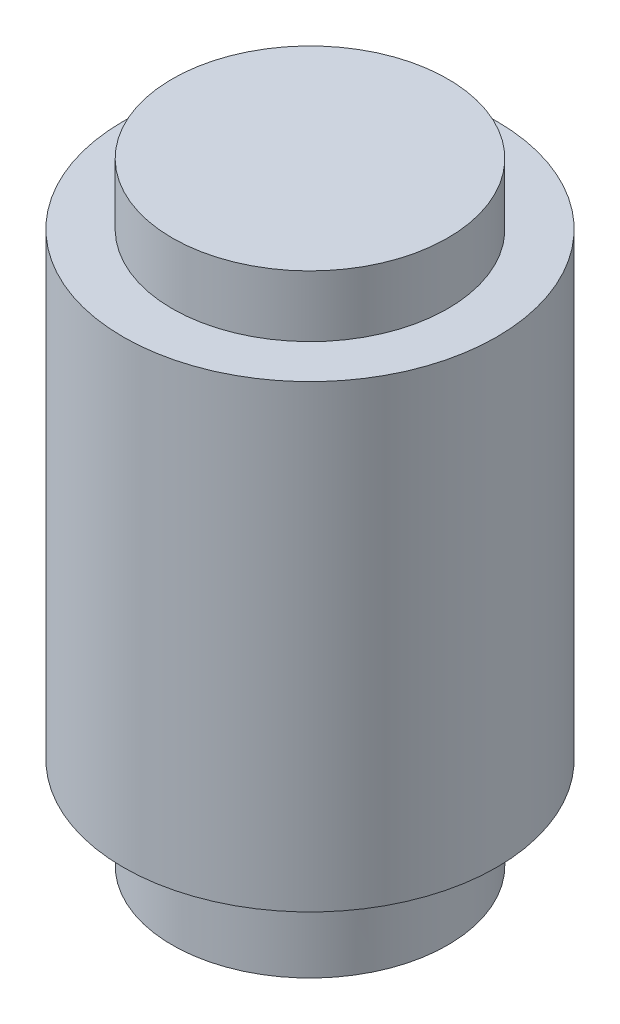
ISO-10303-21;
HEADER;
FILE_DESCRIPTION(('STEP AP214'),'2;1');
FILE_NAME('part.step','',(''),(''),'','','');
FILE_SCHEMA(('AUTOMOTIVE_DESIGN { 1 0 10303 214 1 1 1 1 }'));
ENDSEC;
DATA;
#1=APPLICATION_CONTEXT('core data for automotive mechanical design processes');
#2=APPLICATION_PROTOCOL_DEFINITION('international standard','automotive_design',2000,#1);
#3=PRODUCT_CONTEXT('',#1,'mechanical');
#4=PRODUCT('Part','Part','',(#3));
#5=PRODUCT_RELATED_PRODUCT_CATEGORY('part','',(#4));
#6=PRODUCT_DEFINITION_FORMATION('','',#4);
#7=PRODUCT_DEFINITION_CONTEXT('part definition',#1,'design');
#8=PRODUCT_DEFINITION('design','',#6,#7);
#9=PRODUCT_DEFINITION_SHAPE('','',#8);
#10=(LENGTH_UNIT() NAMED_UNIT(*) SI_UNIT(.MILLI.,.METRE.));
#11=(NAMED_UNIT(*) PLANE_ANGLE_UNIT() SI_UNIT($,.RADIAN.));
#12=(NAMED_UNIT(*) SI_UNIT($,.STERADIAN.) SOLID_ANGLE_UNIT());
#13=UNCERTAINTY_MEASURE_WITH_UNIT(LENGTH_MEASURE(1.E-05),#10,'distance_accuracy_value','');
#14=(GEOMETRIC_REPRESENTATION_CONTEXT(3) GLOBAL_UNCERTAINTY_ASSIGNED_CONTEXT((#13)) GLOBAL_UNIT_ASSIGNED_CONTEXT((#10,
#11,#12)) REPRESENTATION_CONTEXT('',''));
#15=CARTESIAN_POINT('',(0.,0.,0.));
#16=DIRECTION('',(0.,0.,1.));
#17=DIRECTION('',(1.,0.,0.));
#18=AXIS2_PLACEMENT_3D('',#15,#16,#17);
#19=CARTESIAN_POINT('',(0.,110.,0.));
#20=DIRECTION('',(0.,-1.,0.));
#21=DIRECTION('',(0.,0.,-1.));
#22=AXIS2_PLACEMENT_3D('',#19,#20,#21);
#23=CYLINDRICAL_SURFACE('',#22,22.5);
#24=CARTESIAN_POINT('',(0.,10.,0.));
#25=DIRECTION('',(0.,-1.,0.));
#26=DIRECTION('',(0.,0.,-1.));
#27=AXIS2_PLACEMENT_3D('',#24,#25,#26);
#28=CIRCLE('',#27,22.5);
#29=CARTESIAN_POINT('',(0.,10.,-22.5));
#30=VERTEX_POINT('',#29);
#31=EDGE_CURVE('E61',#30,#30,#28,.T.);
#32=ORIENTED_EDGE('',*,*,#31,.F.);
#33=EDGE_LOOP('',(#32));
#34=FACE_BOUND('',#33,.T.);
#35=CARTESIAN_POINT('',(0.,25.,0.));
#36=DIRECTION('',(0.,1.,0.));
#37=DIRECTION('',(0.,0.,1.));
#38=AXIS2_PLACEMENT_3D('',#35,#36,#37);
#39=CIRCLE('',#38,22.5);
#40=CARTESIAN_POINT('',(0.,25.,22.5));
#41=VERTEX_POINT('',#40);
#42=EDGE_CURVE('E11',#41,#41,#39,.T.);
#43=ORIENTED_EDGE('',*,*,#42,.F.);
#44=EDGE_LOOP('',(#43));
#45=FACE_BOUND('',#44,.T.);
#46=ADVANCED_FACE('F39',(#34,#45),#23,.T.);
#47=CARTESIAN_POINT('',(0.,10.,0.));
#48=DIRECTION('',(0.,-1.,0.));
#49=DIRECTION('',(0.,0.,-1.));
#50=AXIS2_PLACEMENT_3D('',#47,#48,#49);
#51=PLANE('',#50);
#52=ORIENTED_EDGE('',*,*,#31,.T.);
#53=EDGE_LOOP('',(#52));
#54=FACE_BOUND('',#53,.T.);
#55=CARTESIAN_POINT('',(0.,10.,0.));
#56=DIRECTION('',(0.,-1.,0.));
#57=DIRECTION('',(0.,0.,-1.));
#58=AXIS2_PLACEMENT_3D('',#55,#56,#57);
#59=CIRCLE('',#58,16.7);
#60=CARTESIAN_POINT('',(0.,10.,-16.7));
#61=VERTEX_POINT('',#60);
#62=EDGE_CURVE('E60',#61,#61,#59,.F.);
#63=ORIENTED_EDGE('',*,*,#62,.T.);
#64=EDGE_LOOP('',(#63));
#65=FACE_BOUND('',#64,.T.);
#66=ADVANCED_FACE('F105',(#54,#65),#51,.T.);
#67=CARTESIAN_POINT('',(0.,157.234732983261,0.));
#68=DIRECTION('',(0.,-1.,0.));
#69=DIRECTION('',(0.,0.,-1.));
#70=AXIS2_PLACEMENT_3D('',#67,#68,#69);
#71=CYLINDRICAL_SURFACE('',#70,16.7);
#72=CARTESIAN_POINT('',(0.,90.,0.));
#73=DIRECTION('',(0.,1.,0.));
#74=DIRECTION('',(0.,0.,1.));
#75=AXIS2_PLACEMENT_3D('',#72,#73,#74);
#76=CIRCLE('',#75,16.7);
#77=CARTESIAN_POINT('',(0.,90.,16.7));
#78=VERTEX_POINT('',#77);
#79=EDGE_CURVE('E55',#78,#78,#76,.F.);
#80=ORIENTED_EDGE('',*,*,#79,.F.);
#81=EDGE_LOOP('',(#80));
#82=FACE_BOUND('',#81,.T.);
#83=ORIENTED_EDGE('',*,*,#62,.F.);
#84=EDGE_LOOP('',(#83));
#85=FACE_BOUND('',#84,.T.);
#86=ADVANCED_FACE('F110',(#82,#85),#71,.F.);
#87=CARTESIAN_POINT('',(0.,90.,0.));
#88=DIRECTION('',(0.,1.,0.));
#89=DIRECTION('',(0.,0.,1.));
#90=AXIS2_PLACEMENT_3D('',#87,#88,#89);
#91=PLANE('',#90);
#92=ORIENTED_EDGE('',*,*,#79,.T.);
#93=EDGE_LOOP('',(#92));
#94=FACE_BOUND('',#93,.T.);
#95=CARTESIAN_POINT('',(0.,90.,0.));
#96=DIRECTION('',(0.,1.,0.));
#97=DIRECTION('',(0.,0.,1.));
#98=AXIS2_PLACEMENT_3D('',#95,#96,#97);
#99=CIRCLE('',#98,13.3);
#100=CARTESIAN_POINT('',(0.,90.,13.3));
#101=VERTEX_POINT('',#100);
#102=EDGE_CURVE('E50',#101,#101,#99,.F.);
#103=ORIENTED_EDGE('',*,*,#102,.F.);
#104=EDGE_LOOP('',(#103));
#105=FACE_BOUND('',#104,.T.);
#106=ADVANCED_FACE('F120',(#94,#105),#91,.F.);
#107=CARTESIAN_POINT('',(0.,157.234732983261,0.));
#108=DIRECTION('',(0.,-1.,0.));
#109=DIRECTION('',(0.,0.,-1.));
#110=AXIS2_PLACEMENT_3D('',#107,#108,#109);
#111=CYLINDRICAL_SURFACE('',#110,13.3);
#112=ORIENTED_EDGE('',*,*,#102,.T.);
#113=EDGE_LOOP('',(#112));
#114=FACE_BOUND('',#113,.T.);
#115=CARTESIAN_POINT('',(0.,10.,0.));
#116=DIRECTION('',(0.,-1.,0.));
#117=DIRECTION('',(0.,0.,-1.));
#118=AXIS2_PLACEMENT_3D('',#115,#116,#117);
#119=CIRCLE('',#118,13.3);
#120=CARTESIAN_POINT('',(0.,10.,-13.3));
#121=VERTEX_POINT('',#120);
#122=EDGE_CURVE('E58',#121,#121,#119,.F.);
#123=ORIENTED_EDGE('',*,*,#122,.T.);
#124=EDGE_LOOP('',(#123));
#125=FACE_BOUND('',#124,.T.);
#126=ADVANCED_FACE('F102',(#114,#125),#111,.T.);
#127=ORIENTED_EDGE('',*,*,#122,.F.);
#128=EDGE_LOOP('',(#127));
#129=FACE_BOUND('',#128,.T.);
#130=ADVANCED_FACE('F93',(#129),#51,.T.);
#131=CARTESIAN_POINT('',(0.,25.,0.));
#132=DIRECTION('',(0.,1.,0.));
#133=DIRECTION('',(0.,0.,1.));
#134=AXIS2_PLACEMENT_3D('',#131,#132,#133);
#135=CYLINDRICAL_SURFACE('',#134,30.5);
#136=CARTESIAN_POINT('',(0.,25.,0.));
#137=DIRECTION('',(0.,1.,0.));
#138=DIRECTION('',(0.,0.,1.));
#139=AXIS2_PLACEMENT_3D('',#136,#137,#138);
#140=CIRCLE('',#139,30.5);
#141=CARTESIAN_POINT('',(0.,25.,30.5));
#142=VERTEX_POINT('',#141);
#143=EDGE_CURVE('E67',#142,#142,#140,.T.);
#144=ORIENTED_EDGE('',*,*,#143,.T.);
#145=EDGE_LOOP('',(#144));
#146=FACE_BOUND('',#145,.T.);
#147=CARTESIAN_POINT('',(0.,100.,0.));
#148=DIRECTION('',(0.,1.,0.));
#149=DIRECTION('',(0.,0.,1.));
#150=AXIS2_PLACEMENT_3D('',#147,#148,#149);
#151=CIRCLE('',#150,30.5);
#152=CARTESIAN_POINT('',(0.,100.,30.5));
#153=VERTEX_POINT('',#152);
#154=EDGE_CURVE('E72',#153,#153,#151,.T.);
#155=ORIENTED_EDGE('',*,*,#154,.F.);
#156=EDGE_LOOP('',(#155));
#157=FACE_BOUND('',#156,.T.);
#158=ADVANCED_FACE('F91',(#146,#157),#135,.T.);
#159=CARTESIAN_POINT('',(0.,25.,0.));
#160=DIRECTION('',(0.,1.,0.));
#161=DIRECTION('',(0.,0.,1.));
#162=AXIS2_PLACEMENT_3D('',#159,#160,#161);
#163=PLANE('',#162);
#164=ORIENTED_EDGE('',*,*,#42,.T.);
#165=EDGE_LOOP('',(#164));
#166=FACE_BOUND('',#165,.T.);
#167=ORIENTED_EDGE('',*,*,#143,.F.);
#168=EDGE_LOOP('',(#167));
#169=FACE_BOUND('',#168,.T.);
#170=ADVANCED_FACE('F87',(#166,#169),#163,.F.);
#171=CARTESIAN_POINT('',(0.,100.,0.));
#172=DIRECTION('',(0.,1.,0.));
#173=DIRECTION('',(0.,0.,1.));
#174=AXIS2_PLACEMENT_3D('',#171,#172,#173);
#175=PLANE('',#174);
#176=CARTESIAN_POINT('',(0.,100.,0.));
#177=DIRECTION('',(0.,1.,0.));
#178=DIRECTION('',(0.,0.,1.));
#179=AXIS2_PLACEMENT_3D('',#176,#177,#178);
#180=CIRCLE('',#179,22.5);
#181=CARTESIAN_POINT('',(0.,100.,22.5));
#182=VERTEX_POINT('',#181);
#183=EDGE_CURVE('E76',#182,#182,#180,.T.);
#184=ORIENTED_EDGE('',*,*,#183,.F.);
#185=EDGE_LOOP('',(#184));
#186=FACE_BOUND('',#185,.T.);
#187=ORIENTED_EDGE('',*,*,#154,.T.);
#188=EDGE_LOOP('',(#187));
#189=FACE_BOUND('',#188,.T.);
#190=ADVANCED_FACE('F83',(#186,#189),#175,.T.);
#191=CARTESIAN_POINT('',(0.,110.,0.));
#192=DIRECTION('',(0.,1.,0.));
#193=DIRECTION('',(0.,0.,1.));
#194=AXIS2_PLACEMENT_3D('',#191,#192,#193);
#195=PLANE('',#194);
#196=CARTESIAN_POINT('',(0.,110.,0.));
#197=DIRECTION('',(0.,1.,0.));
#198=DIRECTION('',(0.,0.,1.));
#199=AXIS2_PLACEMENT_3D('',#196,#197,#198);
#200=CIRCLE('',#199,22.5);
#201=CARTESIAN_POINT('',(0.,110.,22.5));
#202=VERTEX_POINT('',#201);
#203=EDGE_CURVE('E46',#202,#202,#200,.T.);
#204=ORIENTED_EDGE('',*,*,#203,.T.);
#205=EDGE_LOOP('',(#204));
#206=FACE_BOUND('',#205,.T.);
#207=ADVANCED_FACE('F86',(#206),#195,.T.);
#208=ORIENTED_EDGE('',*,*,#183,.T.);
#209=EDGE_LOOP('',(#208));
#210=FACE_BOUND('',#209,.T.);
#211=ORIENTED_EDGE('',*,*,#203,.F.);
#212=EDGE_LOOP('',(#211));
#213=FACE_BOUND('',#212,.T.);
#214=ADVANCED_FACE('F41',(#210,#213),#23,.T.);
#215=CLOSED_SHELL('',(#46,#66,#86,#106,#126,#130,#158,#170,#190,#207,#214));
#216=MANIFOLD_SOLID_BREP('B2',#215);
#217=ADVANCED_BREP_SHAPE_REPRESENTATION('',(#18,#216),#14);
#218=SHAPE_DEFINITION_REPRESENTATION(#9,#217);
ENDSEC;
END-ISO-10303-21;
